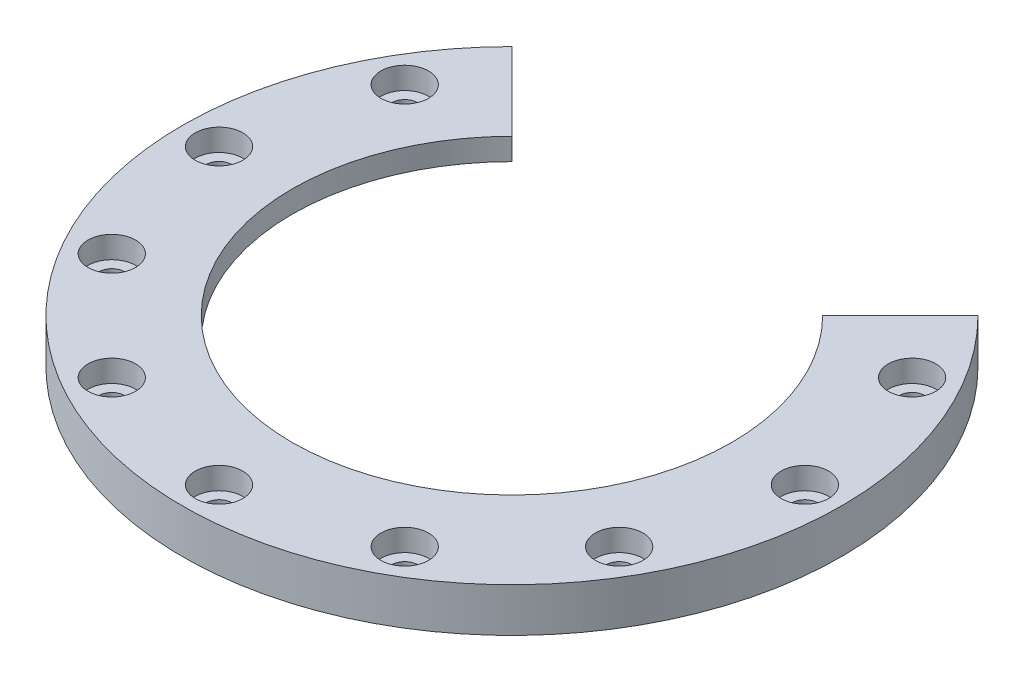
ISO-10303-21;
HEADER;
FILE_DESCRIPTION(('STEP AP214'),'2;1');
FILE_NAME('part.step','',(''),(''),'','','');
FILE_SCHEMA(('AUTOMOTIVE_DESIGN { 1 0 10303 214 1 1 1 1 }'));
ENDSEC;
DATA;
#1=APPLICATION_CONTEXT('core data for automotive mechanical design processes');
#2=APPLICATION_PROTOCOL_DEFINITION('international standard','automotive_design',2000,#1);
#3=PRODUCT_CONTEXT('',#1,'mechanical');
#4=PRODUCT('Part','Part','',(#3));
#5=PRODUCT_RELATED_PRODUCT_CATEGORY('part','',(#4));
#6=PRODUCT_DEFINITION_FORMATION('','',#4);
#7=PRODUCT_DEFINITION_CONTEXT('part definition',#1,'design');
#8=PRODUCT_DEFINITION('design','',#6,#7);
#9=PRODUCT_DEFINITION_SHAPE('','',#8);
#10=(LENGTH_UNIT() NAMED_UNIT(*) SI_UNIT(.MILLI.,.METRE.));
#11=(NAMED_UNIT(*) PLANE_ANGLE_UNIT() SI_UNIT($,.RADIAN.));
#12=(NAMED_UNIT(*) SI_UNIT($,.STERADIAN.) SOLID_ANGLE_UNIT());
#13=UNCERTAINTY_MEASURE_WITH_UNIT(LENGTH_MEASURE(1.E-05),#10,'distance_accuracy_value','');
#14=(GEOMETRIC_REPRESENTATION_CONTEXT(3) GLOBAL_UNCERTAINTY_ASSIGNED_CONTEXT((#13)) GLOBAL_UNIT_ASSIGNED_CONTEXT((#10,
#11,#12)) REPRESENTATION_CONTEXT('',''));
#15=CARTESIAN_POINT('',(0.,0.,0.));
#16=DIRECTION('',(0.,0.,1.));
#17=DIRECTION('',(1.,0.,0.));
#18=AXIS2_PLACEMENT_3D('',#15,#16,#17);
#19=CARTESIAN_POINT('',(0.,6.,0.));
#20=DIRECTION('',(0.,-1.,0.));
#21=DIRECTION('',(0.,0.,-1.));
#22=AXIS2_PLACEMENT_3D('',#19,#20,#21);
#23=CYLINDRICAL_SURFACE('',#22,30.);
#24=CARTESIAN_POINT('',(0.,3.,0.));
#25=DIRECTION('',(0.,-1.,0.));
#26=DIRECTION('',(0.,0.,-1.));
#27=AXIS2_PLACEMENT_3D('',#24,#25,#26);
#28=CIRCLE('',#27,30.);
#29=CARTESIAN_POINT('',(21.2132034355963,3.,-21.2132034355965));
#30=VERTEX_POINT('',#29);
#31=CARTESIAN_POINT('',(-21.2132034355963,3.,-21.2132034355965));
#32=VERTEX_POINT('',#31);
#33=EDGE_CURVE('E107',#30,#32,#28,.T.);
#34=ORIENTED_EDGE('',*,*,#33,.T.);
#35=DIRECTION('',(0.,-1.,0.));
#36=VECTOR('',#35,1.);
#37=CARTESIAN_POINT('',(-21.2132034355963,6.,-21.2132034355965));
#38=LINE('',#37,#36);
#39=CARTESIAN_POINT('',(-21.2132034355963,6.,-21.2132034355965));
#40=VERTEX_POINT('',#39);
#41=EDGE_CURVE('E56',#32,#40,#38,.F.);
#42=ORIENTED_EDGE('',*,*,#41,.T.);
#43=CARTESIAN_POINT('',(0.,6.,0.));
#44=DIRECTION('',(0.,1.,0.));
#45=DIRECTION('',(0.,0.,1.));
#46=AXIS2_PLACEMENT_3D('',#43,#44,#45);
#47=CIRCLE('',#46,30.);
#48=CARTESIAN_POINT('',(21.2132034355963,6.,-21.2132034355965));
#49=VERTEX_POINT('',#48);
#50=EDGE_CURVE('E141',#40,#49,#47,.T.);
#51=ORIENTED_EDGE('',*,*,#50,.T.);
#52=DIRECTION('',(0.,-1.,0.));
#53=VECTOR('',#52,1.);
#54=CARTESIAN_POINT('',(21.2132034355963,6.,-21.2132034355965));
#55=LINE('',#54,#53);
#56=EDGE_CURVE('E101',#49,#30,#55,.T.);
#57=ORIENTED_EDGE('',*,*,#56,.T.);
#58=EDGE_LOOP('',(#34,#42,#51,#57));
#59=FACE_BOUND('',#58,.T.);
#60=ADVANCED_FACE('F33',(#59),#23,.F.);
#61=CARTESIAN_POINT('',(0.,6.,0.));
#62=DIRECTION('',(0.,1.,0.));
#63=DIRECTION('',(0.,0.,1.));
#64=AXIS2_PLACEMENT_3D('',#61,#62,#63);
#65=PLANE('',#64);
#66=CARTESIAN_POINT('',(40.0000000000057,6.,-5.67944329888421E-12));
#67=DIRECTION('',(0.,1.,0.));
#68=DIRECTION('',(0.,0.,1.));
#69=AXIS2_PLACEMENT_3D('',#66,#67,#68);
#70=CIRCLE('',#69,3.25);
#71=CARTESIAN_POINT('',(40.0000000000057,6.,3.24999999999432));
#72=VERTEX_POINT('',#71);
#73=EDGE_CURVE('E175',#72,#72,#70,.T.);
#74=ORIENTED_EDGE('',*,*,#73,.F.);
#75=EDGE_LOOP('',(#74));
#76=FACE_BOUND('',#75,.T.);
#77=CARTESIAN_POINT('',(34.6410161513769,6.,-20.000000000007));
#78=DIRECTION('',(0.,1.,0.));
#79=DIRECTION('',(0.,0.,1.));
#80=AXIS2_PLACEMENT_3D('',#77,#78,#79);
#81=CIRCLE('',#80,3.25);
#82=CARTESIAN_POINT('',(34.6410161513769,6.,-16.7500000000071));
#83=VERTEX_POINT('',#82);
#84=EDGE_CURVE('E196',#83,#83,#81,.T.);
#85=ORIENTED_EDGE('',*,*,#84,.F.);
#86=EDGE_LOOP('',(#85));
#87=FACE_BOUND('',#86,.T.);
#88=CARTESIAN_POINT('',(-34.6410161513881,6.,-19.9999999999876));
#89=DIRECTION('',(0.,1.,0.));
#90=DIRECTION('',(0.,0.,1.));
#91=AXIS2_PLACEMENT_3D('',#88,#89,#90);
#92=CIRCLE('',#91,3.25);
#93=CARTESIAN_POINT('',(-34.6410161513881,6.,-16.7499999999876));
#94=VERTEX_POINT('',#93);
#95=EDGE_CURVE('E235',#94,#94,#92,.T.);
#96=ORIENTED_EDGE('',*,*,#95,.F.);
#97=EDGE_LOOP('',(#96));
#98=FACE_BOUND('',#97,.T.);
#99=CARTESIAN_POINT('',(-40.0000000000057,6.,1.66977542903655E-11));
#100=DIRECTION('',(0.,1.,0.));
#101=DIRECTION('',(0.,0.,1.));
#102=AXIS2_PLACEMENT_3D('',#99,#100,#101);
#103=CIRCLE('',#102,3.25);
#104=CARTESIAN_POINT('',(-40.0000000000057,6.,3.2500000000167));
#105=VERTEX_POINT('',#104);
#106=EDGE_CURVE('E229',#105,#105,#103,.T.);
#107=ORIENTED_EDGE('',*,*,#106,.F.);
#108=EDGE_LOOP('',(#107));
#109=FACE_BOUND('',#108,.T.);
#110=CARTESIAN_POINT('',(-34.6410161513769,6.,20.000000000018));
#111=DIRECTION('',(0.,1.,0.));
#112=DIRECTION('',(0.,0.,1.));
#113=AXIS2_PLACEMENT_3D('',#110,#111,#112);
#114=CIRCLE('',#113,3.25);
#115=CARTESIAN_POINT('',(-34.6410161513769,6.,23.250000000018));
#116=VERTEX_POINT('',#115);
#117=EDGE_CURVE('E223',#116,#116,#114,.T.);
#118=ORIENTED_EDGE('',*,*,#117,.F.);
#119=EDGE_LOOP('',(#118));
#120=FACE_BOUND('',#119,.T.);
#121=CARTESIAN_POINT('',(-19.9999999999931,6.,34.6410161513936));
#122=DIRECTION('',(0.,1.,0.));
#123=DIRECTION('',(0.,0.,1.));
#124=AXIS2_PLACEMENT_3D('',#121,#122,#123);
#125=CIRCLE('',#124,3.25);
#126=CARTESIAN_POINT('',(-19.9999999999931,6.,37.8910161513936));
#127=VERTEX_POINT('',#126);
#128=EDGE_CURVE('E217',#127,#127,#125,.T.);
#129=ORIENTED_EDGE('',*,*,#128,.F.);
#130=EDGE_LOOP('',(#129));
#131=FACE_BOUND('',#130,.T.);
#132=CARTESIAN_POINT('',(1.11885987946249E-11,6.,40.0000000000112));
#133=DIRECTION('',(0.,1.,0.));
#134=DIRECTION('',(0.,0.,1.));
#135=AXIS2_PLACEMENT_3D('',#132,#133,#134);
#136=CIRCLE('',#135,3.25);
#137=CARTESIAN_POINT('',(1.11885987946249E-11,6.,43.2500000000112));
#138=VERTEX_POINT('',#137);
#139=EDGE_CURVE('E211',#138,#138,#136,.T.);
#140=ORIENTED_EDGE('',*,*,#139,.F.);
#141=EDGE_LOOP('',(#140));
#142=FACE_BOUND('',#141,.T.);
#143=CARTESIAN_POINT('',(20.0000000000125,6.,34.6410161513824));
#144=DIRECTION('',(0.,1.,0.));
#145=DIRECTION('',(0.,0.,1.));
#146=AXIS2_PLACEMENT_3D('',#143,#144,#145);
#147=CIRCLE('',#146,3.25);
#148=CARTESIAN_POINT('',(20.0000000000125,6.,37.8910161513824));
#149=VERTEX_POINT('',#148);
#150=EDGE_CURVE('E205',#149,#149,#147,.T.);
#151=ORIENTED_EDGE('',*,*,#150,.F.);
#152=EDGE_LOOP('',(#151));
#153=FACE_BOUND('',#152,.T.);
#154=CARTESIAN_POINT('',(34.6410161513881,6.,19.9999999999987));
#155=DIRECTION('',(0.,1.,0.));
#156=DIRECTION('',(0.,0.,1.));
#157=AXIS2_PLACEMENT_3D('',#154,#155,#156);
#158=CIRCLE('',#157,3.25);
#159=CARTESIAN_POINT('',(34.6410161513881,6.,23.2499999999987));
#160=VERTEX_POINT('',#159);
#161=EDGE_CURVE('E199',#160,#160,#158,.T.);
#162=ORIENTED_EDGE('',*,*,#161,.F.);
#163=EDGE_LOOP('',(#162));
#164=FACE_BOUND('',#163,.T.);
#165=ORIENTED_EDGE('',*,*,#50,.F.);
#166=DIRECTION('',(-0.707106781186544,0.,-0.707106781186551));
#167=VECTOR('',#166,1.);
#168=CARTESIAN_POINT('',(0.,6.,0.));
#169=LINE('',#168,#167);
#170=CARTESIAN_POINT('',(-31.8198051533945,6.,-31.8198051533948));
#171=VERTEX_POINT('',#170);
#172=EDGE_CURVE('E191',#40,#171,#169,.T.);
#173=ORIENTED_EDGE('',*,*,#172,.T.);
#174=CARTESIAN_POINT('',(0.,6.,0.));
#175=DIRECTION('',(0.,1.,0.));
#176=DIRECTION('',(0.,0.,1.));
#177=AXIS2_PLACEMENT_3D('',#174,#175,#176);
#178=CIRCLE('',#177,45.);
#179=CARTESIAN_POINT('',(31.8198051533945,6.,-31.8198051533948));
#180=VERTEX_POINT('',#179);
#181=EDGE_CURVE('E145',#171,#180,#178,.T.);
#182=ORIENTED_EDGE('',*,*,#181,.T.);
#183=DIRECTION('',(-0.707106781186544,0.,0.707106781186551));
#184=VECTOR('',#183,1.);
#185=CARTESIAN_POINT('',(0.,6.,0.));
#186=LINE('',#185,#184);
#187=EDGE_CURVE('E183',#180,#49,#186,.T.);
#188=ORIENTED_EDGE('',*,*,#187,.T.);
#189=EDGE_LOOP('',(#165,#173,#182,#188));
#190=FACE_BOUND('',#189,.T.);
#191=ADVANCED_FACE('F249',(#76,#87,#98,#109,#120,#131,#142,#153,#164,#190),#65,.T.);
#192=CARTESIAN_POINT('',(0.,0.,0.));
#193=DIRECTION('',(0.,1.,0.));
#194=DIRECTION('',(0.,0.,1.));
#195=AXIS2_PLACEMENT_3D('',#192,#193,#194);
#196=PLANE('',#195);
#197=CARTESIAN_POINT('',(-34.6410161513747,0.,-19.9999999999951));
#198=DIRECTION('',(0.,1.,0.));
#199=DIRECTION('',(0.,0.,1.));
#200=AXIS2_PLACEMENT_3D('',#197,#198,#199);
#201=CIRCLE('',#200,1.75000000000464);
#202=CARTESIAN_POINT('',(-34.6410161513747,0.,-18.2499999999904));
#203=VERTEX_POINT('',#202);
#204=EDGE_CURVE('E114',#203,#203,#201,.T.);
#205=ORIENTED_EDGE('',*,*,#204,.T.);
#206=EDGE_LOOP('',(#205));
#207=FACE_BOUND('',#206,.T.);
#208=CARTESIAN_POINT('',(-39.9999999999943,0.,5.6843418860808E-12));
#209=DIRECTION('',(0.,1.,0.));
#210=DIRECTION('',(0.,0.,1.));
#211=AXIS2_PLACEMENT_3D('',#208,#209,#210);
#212=CIRCLE('',#211,1.75000000000749);
#213=CARTESIAN_POINT('',(-39.9999999999943,0.,1.75000000001318));
#214=VERTEX_POINT('',#213);
#215=EDGE_CURVE('E117',#214,#214,#212,.T.);
#216=ORIENTED_EDGE('',*,*,#215,.T.);
#217=EDGE_LOOP('',(#216));
#218=FACE_BOUND('',#217,.T.);
#219=CARTESIAN_POINT('',(-34.641016151369,0.,20.0000000000049));
#220=DIRECTION('',(0.,1.,0.));
#221=DIRECTION('',(0.,0.,1.));
#222=AXIS2_PLACEMENT_3D('',#219,#220,#221);
#223=CIRCLE('',#222,1.75000000000994);
#224=CARTESIAN_POINT('',(-34.641016151369,0.,21.7500000000149));
#225=VERTEX_POINT('',#224);
#226=EDGE_CURVE('E120',#225,#225,#223,.T.);
#227=ORIENTED_EDGE('',*,*,#226,.T.);
#228=EDGE_LOOP('',(#227));
#229=FACE_BOUND('',#228,.T.);
#230=CARTESIAN_POINT('',(-19.9999999999894,0.,34.6410161513804));
#231=DIRECTION('',(0.,1.,0.));
#232=DIRECTION('',(0.,0.,1.));
#233=AXIS2_PLACEMENT_3D('',#230,#231,#232);
#234=CIRCLE('',#233,1.75000000001128);
#235=CARTESIAN_POINT('',(-19.9999999999894,0.,36.3910161513917));
#236=VERTEX_POINT('',#235);
#237=EDGE_CURVE('E123',#236,#236,#234,.T.);
#238=ORIENTED_EDGE('',*,*,#237,.T.);
#239=EDGE_LOOP('',(#238));
#240=FACE_BOUND('',#239,.T.);
#241=CARTESIAN_POINT('',(1.13588865977684E-11,0.,40.));
#242=DIRECTION('',(0.,1.,0.));
#243=DIRECTION('',(0.,0.,1.));
#244=AXIS2_PLACEMENT_3D('',#241,#242,#243);
#245=CIRCLE('',#244,1.75000000001113);
#246=CARTESIAN_POINT('',(1.13588865977684E-11,0.,41.7500000000111));
#247=VERTEX_POINT('',#246);
#248=EDGE_CURVE('E126',#247,#247,#245,.T.);
#249=ORIENTED_EDGE('',*,*,#248,.T.);
#250=EDGE_LOOP('',(#249));
#251=FACE_BOUND('',#250,.T.);
#252=CARTESIAN_POINT('',(20.0000000000106,0.,34.6410161513747));
#253=DIRECTION('',(0.,1.,0.));
#254=DIRECTION('',(0.,0.,1.));
#255=AXIS2_PLACEMENT_3D('',#252,#253,#254);
#256=CIRCLE('',#255,1.75000000000955);
#257=CARTESIAN_POINT('',(20.0000000000106,0.,36.3910161513842));
#258=VERTEX_POINT('',#257);
#259=EDGE_CURVE('E129',#258,#258,#256,.T.);
#260=ORIENTED_EDGE('',*,*,#259,.T.);
#261=EDGE_LOOP('',(#260));
#262=FACE_BOUND('',#261,.T.);
#263=CARTESIAN_POINT('',(34.6410161513861,0.,19.9999999999951));
#264=DIRECTION('',(0.,1.,0.));
#265=DIRECTION('',(0.,0.,1.));
#266=AXIS2_PLACEMENT_3D('',#263,#264,#265);
#267=CIRCLE('',#266,1.75000000000689);
#268=CARTESIAN_POINT('',(34.6410161513861,0.,21.750000000002));
#269=VERTEX_POINT('',#268);
#270=EDGE_CURVE('E132',#269,#269,#267,.T.);
#271=ORIENTED_EDGE('',*,*,#270,.T.);
#272=EDGE_LOOP('',(#271));
#273=FACE_BOUND('',#272,.T.);
#274=CARTESIAN_POINT('',(40.0000000000057,0.,-5.67944329888421E-12));
#275=DIRECTION('',(0.,1.,0.));
#276=DIRECTION('',(0.,0.,1.));
#277=AXIS2_PLACEMENT_3D('',#274,#275,#276);
#278=CIRCLE('',#277,1.75000000000391);
#279=CARTESIAN_POINT('',(40.0000000000057,0.,1.74999999999823));
#280=VERTEX_POINT('',#279);
#281=EDGE_CURVE('E135',#280,#280,#278,.T.);
#282=ORIENTED_EDGE('',*,*,#281,.T.);
#283=EDGE_LOOP('',(#282));
#284=FACE_BOUND('',#283,.T.);
#285=CARTESIAN_POINT('',(34.6410161513804,0.,-20.0000000000049));
#286=DIRECTION('',(0.,1.,0.));
#287=DIRECTION('',(0.,0.,1.));
#288=AXIS2_PLACEMENT_3D('',#285,#286,#287);
#289=CIRCLE('',#288,1.75000000000137);
#290=CARTESIAN_POINT('',(34.6410161513804,0.,-18.2500000000036));
#291=VERTEX_POINT('',#290);
#292=EDGE_CURVE('E138',#291,#291,#289,.T.);
#293=ORIENTED_EDGE('',*,*,#292,.T.);
#294=EDGE_LOOP('',(#293));
#295=FACE_BOUND('',#294,.T.);
#296=DIRECTION('',(0.707106781186544,0.,0.707106781186551));
#297=VECTOR('',#296,1.);
#298=CARTESIAN_POINT('',(-38.8908729652599,0.,-38.8908729652603));
#299=LINE('',#298,#297);
#300=CARTESIAN_POINT('',(-31.8198051533945,0.,-31.8198051533948));
#301=VERTEX_POINT('',#300);
#302=CARTESIAN_POINT('',(-25.1022907321223,0.,-25.1022907321226));
#303=VERTEX_POINT('',#302);
#304=EDGE_CURVE('E91',#301,#303,#299,.T.);
#305=ORIENTED_EDGE('',*,*,#304,.T.);
#306=CARTESIAN_POINT('',(0.,0.,0.));
#307=DIRECTION('',(0.,-1.,0.));
#308=DIRECTION('',(0.,0.,-1.));
#309=AXIS2_PLACEMENT_3D('',#306,#307,#308);
#310=CIRCLE('',#309,35.5);
#311=CARTESIAN_POINT('',(25.1022907321223,0.,-25.1022907321226));
#312=VERTEX_POINT('',#311);
#313=EDGE_CURVE('E98',#312,#303,#310,.T.);
#314=ORIENTED_EDGE('',*,*,#313,.F.);
#315=DIRECTION('',(0.707106781186544,0.,-0.707106781186551));
#316=VECTOR('',#315,1.);
#317=CARTESIAN_POINT('',(38.8908729652599,0.,-38.8908729652603));
#318=LINE('',#317,#316);
#319=CARTESIAN_POINT('',(31.8198051533945,0.,-31.8198051533948));
#320=VERTEX_POINT('',#319);
#321=EDGE_CURVE('E83',#312,#320,#318,.T.);
#322=ORIENTED_EDGE('',*,*,#321,.T.);
#323=CARTESIAN_POINT('',(0.,0.,0.));
#324=DIRECTION('',(0.,1.,0.));
#325=DIRECTION('',(0.,0.,1.));
#326=AXIS2_PLACEMENT_3D('',#323,#324,#325);
#327=CIRCLE('',#326,45.);
#328=EDGE_CURVE('E144',#301,#320,#327,.T.);
#329=ORIENTED_EDGE('',*,*,#328,.F.);
#330=EDGE_LOOP('',(#305,#314,#322,#329));
#331=FACE_BOUND('',#330,.T.);
#332=ADVANCED_FACE('F104',(#207,#218,#229,#240,#251,#262,#273,#284,#295,#331),#196,.F.);
#333=CARTESIAN_POINT('',(0.,6.,0.));
#334=DIRECTION('',(0.,-1.,0.));
#335=DIRECTION('',(0.,0.,-1.));
#336=AXIS2_PLACEMENT_3D('',#333,#334,#335);
#337=CYLINDRICAL_SURFACE('',#336,45.);
#338=DIRECTION('',(0.,-1.,0.));
#339=VECTOR('',#338,1.);
#340=CARTESIAN_POINT('',(-31.8198051533945,6.,-31.8198051533948));
#341=LINE('',#340,#339);
#342=EDGE_CURVE('E194',#301,#171,#341,.F.);
#343=ORIENTED_EDGE('',*,*,#342,.F.);
#344=ORIENTED_EDGE('',*,*,#328,.T.);
#345=DIRECTION('',(0.,-1.,0.));
#346=VECTOR('',#345,1.);
#347=CARTESIAN_POINT('',(31.8198051533945,6.,-31.8198051533948));
#348=LINE('',#347,#346);
#349=EDGE_CURVE('E86',#180,#320,#348,.T.);
#350=ORIENTED_EDGE('',*,*,#349,.F.);
#351=ORIENTED_EDGE('',*,*,#181,.F.);
#352=EDGE_LOOP('',(#343,#344,#350,#351));
#353=FACE_BOUND('',#352,.T.);
#354=ADVANCED_FACE('F35',(#353),#337,.T.);
#355=CARTESIAN_POINT('',(0.,3.,0.));
#356=DIRECTION('',(0.,-1.,0.));
#357=DIRECTION('',(0.,0.,-1.));
#358=AXIS2_PLACEMENT_3D('',#355,#356,#357);
#359=CYLINDRICAL_SURFACE('',#358,35.5);
#360=DIRECTION('',(0.,-1.,0.));
#361=VECTOR('',#360,1.);
#362=CARTESIAN_POINT('',(-25.1022907321223,3.,-25.1022907321226));
#363=LINE('',#362,#361);
#364=CARTESIAN_POINT('',(-25.1022907321223,3.,-25.1022907321226));
#365=VERTEX_POINT('',#364);
#366=EDGE_CURVE('E188',#365,#303,#363,.T.);
#367=ORIENTED_EDGE('',*,*,#366,.F.);
#368=CARTESIAN_POINT('',(0.,3.,0.));
#369=DIRECTION('',(0.,-1.,0.));
#370=DIRECTION('',(0.,0.,-1.));
#371=AXIS2_PLACEMENT_3D('',#368,#369,#370);
#372=CIRCLE('',#371,35.5);
#373=CARTESIAN_POINT('',(25.1022907321223,3.,-25.1022907321226));
#374=VERTEX_POINT('',#373);
#375=EDGE_CURVE('E100',#374,#365,#372,.T.);
#376=ORIENTED_EDGE('',*,*,#375,.F.);
#377=DIRECTION('',(0.,-1.,0.));
#378=VECTOR('',#377,1.);
#379=CARTESIAN_POINT('',(25.1022907321223,3.,-25.1022907321226));
#380=LINE('',#379,#378);
#381=EDGE_CURVE('E48',#312,#374,#380,.F.);
#382=ORIENTED_EDGE('',*,*,#381,.F.);
#383=ORIENTED_EDGE('',*,*,#313,.T.);
#384=EDGE_LOOP('',(#367,#376,#382,#383));
#385=FACE_BOUND('',#384,.T.);
#386=ADVANCED_FACE('F97',(#385),#359,.F.);
#387=CARTESIAN_POINT('',(0.,3.,0.));
#388=DIRECTION('',(0.,-1.,0.));
#389=DIRECTION('',(0.,0.,-1.));
#390=AXIS2_PLACEMENT_3D('',#387,#388,#389);
#391=PLANE('',#390);
#392=ORIENTED_EDGE('',*,*,#375,.T.);
#393=DIRECTION('',(0.707106781186544,0.,0.707106781186551));
#394=VECTOR('',#393,1.);
#395=CARTESIAN_POINT('',(0.,3.,0.));
#396=LINE('',#395,#394);
#397=EDGE_CURVE('E11',#365,#32,#396,.T.);
#398=ORIENTED_EDGE('',*,*,#397,.T.);
#399=ORIENTED_EDGE('',*,*,#33,.F.);
#400=DIRECTION('',(0.707106781186544,0.,-0.707106781186551));
#401=VECTOR('',#400,1.);
#402=CARTESIAN_POINT('',(0.,3.,0.));
#403=LINE('',#402,#401);
#404=EDGE_CURVE('E41',#30,#374,#403,.T.);
#405=ORIENTED_EDGE('',*,*,#404,.T.);
#406=EDGE_LOOP('',(#392,#398,#399,#405));
#407=FACE_BOUND('',#406,.T.);
#408=ADVANCED_FACE('F178',(#407),#391,.T.);
#409=CARTESIAN_POINT('',(34.6410161513804,6.,-20.0000000000049));
#410=DIRECTION('',(0.,-1.,0.));
#411=DIRECTION('',(0.,0.,-1.));
#412=AXIS2_PLACEMENT_3D('',#409,#410,#411);
#413=CYLINDRICAL_SURFACE('',#412,1.75000000000137);
#414=ORIENTED_EDGE('',*,*,#292,.F.);
#415=EDGE_LOOP('',(#414));
#416=FACE_BOUND('',#415,.T.);
#417=CARTESIAN_POINT('',(34.6410161513804,3.,-20.0000000000049));
#418=DIRECTION('',(0.,1.,0.));
#419=DIRECTION('',(0.,0.,1.));
#420=AXIS2_PLACEMENT_3D('',#417,#418,#419);
#421=CIRCLE('',#420,1.75000000000137);
#422=CARTESIAN_POINT('',(34.6410161513804,3.,-18.2500000000036));
#423=VERTEX_POINT('',#422);
#424=EDGE_CURVE('E173',#423,#423,#421,.T.);
#425=ORIENTED_EDGE('',*,*,#424,.T.);
#426=EDGE_LOOP('',(#425));
#427=FACE_BOUND('',#426,.T.);
#428=ADVANCED_FACE('F288',(#416,#427),#413,.F.);
#429=CARTESIAN_POINT('',(34.6410161513861,6.,19.9999999999951));
#430=DIRECTION('',(0.,-1.,0.));
#431=DIRECTION('',(0.,0.,-1.));
#432=AXIS2_PLACEMENT_3D('',#429,#430,#431);
#433=CYLINDRICAL_SURFACE('',#432,1.75000000000689);
#434=ORIENTED_EDGE('',*,*,#270,.F.);
#435=EDGE_LOOP('',(#434));
#436=FACE_BOUND('',#435,.T.);
#437=CARTESIAN_POINT('',(34.6410161513861,3.,19.9999999999951));
#438=DIRECTION('',(0.,1.,0.));
#439=DIRECTION('',(0.,0.,1.));
#440=AXIS2_PLACEMENT_3D('',#437,#438,#439);
#441=CIRCLE('',#440,1.75000000000689);
#442=CARTESIAN_POINT('',(34.6410161513861,3.,21.750000000002));
#443=VERTEX_POINT('',#442);
#444=EDGE_CURVE('E170',#443,#443,#441,.T.);
#445=ORIENTED_EDGE('',*,*,#444,.T.);
#446=EDGE_LOOP('',(#445));
#447=FACE_BOUND('',#446,.T.);
#448=ADVANCED_FACE('F315',(#436,#447),#433,.F.);
#449=CARTESIAN_POINT('',(20.0000000000106,6.,34.6410161513747));
#450=DIRECTION('',(0.,-1.,0.));
#451=DIRECTION('',(0.,0.,-1.));
#452=AXIS2_PLACEMENT_3D('',#449,#450,#451);
#453=CYLINDRICAL_SURFACE('',#452,1.75000000000955);
#454=ORIENTED_EDGE('',*,*,#259,.F.);
#455=EDGE_LOOP('',(#454));
#456=FACE_BOUND('',#455,.T.);
#457=CARTESIAN_POINT('',(20.0000000000106,3.,34.6410161513747));
#458=DIRECTION('',(0.,1.,0.));
#459=DIRECTION('',(0.,0.,1.));
#460=AXIS2_PLACEMENT_3D('',#457,#458,#459);
#461=CIRCLE('',#460,1.75000000000955);
#462=CARTESIAN_POINT('',(20.0000000000106,3.,36.3910161513842));
#463=VERTEX_POINT('',#462);
#464=EDGE_CURVE('E167',#463,#463,#461,.T.);
#465=ORIENTED_EDGE('',*,*,#464,.T.);
#466=EDGE_LOOP('',(#465));
#467=FACE_BOUND('',#466,.T.);
#468=ADVANCED_FACE('F367',(#456,#467),#453,.F.);
#469=CARTESIAN_POINT('',(1.13588865977684E-11,6.,40.));
#470=DIRECTION('',(0.,-1.,0.));
#471=DIRECTION('',(0.,0.,-1.));
#472=AXIS2_PLACEMENT_3D('',#469,#470,#471);
#473=CYLINDRICAL_SURFACE('',#472,1.75000000001113);
#474=ORIENTED_EDGE('',*,*,#248,.F.);
#475=EDGE_LOOP('',(#474));
#476=FACE_BOUND('',#475,.T.);
#477=CARTESIAN_POINT('',(1.13588865977684E-11,3.,40.));
#478=DIRECTION('',(0.,1.,0.));
#479=DIRECTION('',(0.,0.,1.));
#480=AXIS2_PLACEMENT_3D('',#477,#478,#479);
#481=CIRCLE('',#480,1.75000000001113);
#482=CARTESIAN_POINT('',(1.13588865977684E-11,3.,41.7500000000111));
#483=VERTEX_POINT('',#482);
#484=EDGE_CURVE('E164',#483,#483,#481,.T.);
#485=ORIENTED_EDGE('',*,*,#484,.T.);
#486=EDGE_LOOP('',(#485));
#487=FACE_BOUND('',#486,.T.);
#488=ADVANCED_FACE('F363',(#476,#487),#473,.F.);
#489=CARTESIAN_POINT('',(-19.9999999999894,6.,34.6410161513804));
#490=DIRECTION('',(0.,-1.,0.));
#491=DIRECTION('',(0.,0.,-1.));
#492=AXIS2_PLACEMENT_3D('',#489,#490,#491);
#493=CYLINDRICAL_SURFACE('',#492,1.75000000001128);
#494=ORIENTED_EDGE('',*,*,#237,.F.);
#495=EDGE_LOOP('',(#494));
#496=FACE_BOUND('',#495,.T.);
#497=CARTESIAN_POINT('',(-19.9999999999894,3.,34.6410161513804));
#498=DIRECTION('',(0.,1.,0.));
#499=DIRECTION('',(0.,0.,1.));
#500=AXIS2_PLACEMENT_3D('',#497,#498,#499);
#501=CIRCLE('',#500,1.75000000001128);
#502=CARTESIAN_POINT('',(-19.9999999999894,3.,36.3910161513917));
#503=VERTEX_POINT('',#502);
#504=EDGE_CURVE('E161',#503,#503,#501,.T.);
#505=ORIENTED_EDGE('',*,*,#504,.T.);
#506=EDGE_LOOP('',(#505));
#507=FACE_BOUND('',#506,.T.);
#508=ADVANCED_FACE('F359',(#496,#507),#493,.F.);
#509=CARTESIAN_POINT('',(-34.641016151369,6.,20.0000000000049));
#510=DIRECTION('',(0.,-1.,0.));
#511=DIRECTION('',(0.,0.,-1.));
#512=AXIS2_PLACEMENT_3D('',#509,#510,#511);
#513=CYLINDRICAL_SURFACE('',#512,1.75000000000994);
#514=ORIENTED_EDGE('',*,*,#226,.F.);
#515=EDGE_LOOP('',(#514));
#516=FACE_BOUND('',#515,.T.);
#517=CARTESIAN_POINT('',(-34.641016151369,3.,20.0000000000049));
#518=DIRECTION('',(0.,1.,0.));
#519=DIRECTION('',(0.,0.,1.));
#520=AXIS2_PLACEMENT_3D('',#517,#518,#519);
#521=CIRCLE('',#520,1.75000000000994);
#522=CARTESIAN_POINT('',(-34.641016151369,3.,21.7500000000149));
#523=VERTEX_POINT('',#522);
#524=EDGE_CURVE('E158',#523,#523,#521,.T.);
#525=ORIENTED_EDGE('',*,*,#524,.T.);
#526=EDGE_LOOP('',(#525));
#527=FACE_BOUND('',#526,.T.);
#528=ADVANCED_FACE('F355',(#516,#527),#513,.F.);
#529=CARTESIAN_POINT('',(-39.9999999999943,6.,5.6843418860808E-12));
#530=DIRECTION('',(0.,-1.,0.));
#531=DIRECTION('',(0.,0.,-1.));
#532=AXIS2_PLACEMENT_3D('',#529,#530,#531);
#533=CYLINDRICAL_SURFACE('',#532,1.75000000000749);
#534=ORIENTED_EDGE('',*,*,#215,.F.);
#535=EDGE_LOOP('',(#534));
#536=FACE_BOUND('',#535,.T.);
#537=CARTESIAN_POINT('',(-39.9999999999943,3.,5.6843418860808E-12));
#538=DIRECTION('',(0.,1.,0.));
#539=DIRECTION('',(0.,0.,1.));
#540=AXIS2_PLACEMENT_3D('',#537,#538,#539);
#541=CIRCLE('',#540,1.75000000000749);
#542=CARTESIAN_POINT('',(-39.9999999999943,3.,1.75000000001318));
#543=VERTEX_POINT('',#542);
#544=EDGE_CURVE('E154',#543,#543,#541,.T.);
#545=ORIENTED_EDGE('',*,*,#544,.T.);
#546=EDGE_LOOP('',(#545));
#547=FACE_BOUND('',#546,.T.);
#548=ADVANCED_FACE('F351',(#536,#547),#533,.F.);
#549=CARTESIAN_POINT('',(-34.6410161513747,6.,-19.9999999999951));
#550=DIRECTION('',(0.,-1.,0.));
#551=DIRECTION('',(0.,0.,-1.));
#552=AXIS2_PLACEMENT_3D('',#549,#550,#551);
#553=CYLINDRICAL_SURFACE('',#552,1.75000000000464);
#554=ORIENTED_EDGE('',*,*,#204,.F.);
#555=EDGE_LOOP('',(#554));
#556=FACE_BOUND('',#555,.T.);
#557=CARTESIAN_POINT('',(-34.6410161513747,3.,-19.9999999999951));
#558=DIRECTION('',(0.,1.,0.));
#559=DIRECTION('',(0.,0.,1.));
#560=AXIS2_PLACEMENT_3D('',#557,#558,#559);
#561=CIRCLE('',#560,1.75000000000464);
#562=CARTESIAN_POINT('',(-34.6410161513747,3.,-18.2499999999904));
#563=VERTEX_POINT('',#562);
#564=EDGE_CURVE('E151',#563,#563,#561,.T.);
#565=ORIENTED_EDGE('',*,*,#564,.T.);
#566=EDGE_LOOP('',(#565));
#567=FACE_BOUND('',#566,.T.);
#568=ADVANCED_FACE('F348',(#556,#567),#553,.F.);
#569=CARTESIAN_POINT('',(40.0000000000057,6.,-5.67944329888421E-12));
#570=DIRECTION('',(0.,-1.,0.));
#571=DIRECTION('',(0.,0.,-1.));
#572=AXIS2_PLACEMENT_3D('',#569,#570,#571);
#573=CYLINDRICAL_SURFACE('',#572,1.75000000000391);
#574=ORIENTED_EDGE('',*,*,#281,.F.);
#575=EDGE_LOOP('',(#574));
#576=FACE_BOUND('',#575,.T.);
#577=CARTESIAN_POINT('',(40.0000000000057,3.,-5.67944329888421E-12));
#578=DIRECTION('',(0.,1.,0.));
#579=DIRECTION('',(0.,0.,1.));
#580=AXIS2_PLACEMENT_3D('',#577,#578,#579);
#581=CIRCLE('',#580,1.75000000000391);
#582=CARTESIAN_POINT('',(40.0000000000057,3.,1.74999999999823));
#583=VERTEX_POINT('',#582);
#584=EDGE_CURVE('E105',#583,#583,#581,.T.);
#585=ORIENTED_EDGE('',*,*,#584,.T.);
#586=EDGE_LOOP('',(#585));
#587=FACE_BOUND('',#586,.T.);
#588=ADVANCED_FACE('F342',(#576,#587),#573,.F.);
#589=CARTESIAN_POINT('',(40.0000000000057,3.,-5.67944329888421E-12));
#590=DIRECTION('',(0.,1.,0.));
#591=DIRECTION('',(0.,0.,1.));
#592=AXIS2_PLACEMENT_3D('',#589,#590,#591);
#593=CYLINDRICAL_SURFACE('',#592,3.25);
#594=CARTESIAN_POINT('',(40.0000000000057,3.,-5.67944329888421E-12));
#595=DIRECTION('',(0.,1.,0.));
#596=DIRECTION('',(0.,0.,1.));
#597=AXIS2_PLACEMENT_3D('',#594,#595,#596);
#598=CIRCLE('',#597,3.25);
#599=CARTESIAN_POINT('',(40.0000000000057,3.,3.24999999999432));
#600=VERTEX_POINT('',#599);
#601=EDGE_CURVE('E110',#600,#600,#598,.T.);
#602=ORIENTED_EDGE('',*,*,#601,.F.);
#603=EDGE_LOOP('',(#602));
#604=FACE_BOUND('',#603,.T.);
#605=ORIENTED_EDGE('',*,*,#73,.T.);
#606=EDGE_LOOP('',(#605));
#607=FACE_BOUND('',#606,.T.);
#608=ADVANCED_FACE('F247',(#604,#607),#593,.F.);
#609=CARTESIAN_POINT('',(40.0000000000057,3.,-5.67944329888421E-12));
#610=DIRECTION('',(0.,1.,0.));
#611=DIRECTION('',(0.,0.,1.));
#612=AXIS2_PLACEMENT_3D('',#609,#610,#611);
#613=PLANE('',#612);
#614=ORIENTED_EDGE('',*,*,#584,.F.);
#615=EDGE_LOOP('',(#614));
#616=FACE_BOUND('',#615,.T.);
#617=ORIENTED_EDGE('',*,*,#601,.T.);
#618=EDGE_LOOP('',(#617));
#619=FACE_BOUND('',#618,.T.);
#620=ADVANCED_FACE('F335',(#616,#619),#613,.T.);
#621=CARTESIAN_POINT('',(-34.6410161513881,3.,-19.9999999999876));
#622=DIRECTION('',(0.,1.,0.));
#623=DIRECTION('',(0.,0.,1.));
#624=AXIS2_PLACEMENT_3D('',#621,#622,#623);
#625=CYLINDRICAL_SURFACE('',#624,3.25);
#626=CARTESIAN_POINT('',(-34.6410161513881,3.,-19.9999999999876));
#627=DIRECTION('',(0.,1.,0.));
#628=DIRECTION('',(0.,0.,1.));
#629=AXIS2_PLACEMENT_3D('',#626,#627,#628);
#630=CIRCLE('',#629,3.25);
#631=CARTESIAN_POINT('',(-34.6410161513881,3.,-16.7499999999876));
#632=VERTEX_POINT('',#631);
#633=EDGE_CURVE('E232',#632,#632,#630,.T.);
#634=ORIENTED_EDGE('',*,*,#633,.F.);
#635=EDGE_LOOP('',(#634));
#636=FACE_BOUND('',#635,.T.);
#637=ORIENTED_EDGE('',*,*,#95,.T.);
#638=EDGE_LOOP('',(#637));
#639=FACE_BOUND('',#638,.T.);
#640=ADVANCED_FACE('F338',(#636,#639),#625,.F.);
#641=CARTESIAN_POINT('',(-34.6410161513881,3.,-19.9999999999876));
#642=DIRECTION('',(0.,1.,0.));
#643=DIRECTION('',(0.,0.,1.));
#644=AXIS2_PLACEMENT_3D('',#641,#642,#643);
#645=PLANE('',#644);
#646=ORIENTED_EDGE('',*,*,#564,.F.);
#647=EDGE_LOOP('',(#646));
#648=FACE_BOUND('',#647,.T.);
#649=ORIENTED_EDGE('',*,*,#633,.T.);
#650=EDGE_LOOP('',(#649));
#651=FACE_BOUND('',#650,.T.);
#652=ADVANCED_FACE('F398',(#648,#651),#645,.T.);
#653=CARTESIAN_POINT('',(-40.0000000000057,3.,1.66977542903655E-11));
#654=DIRECTION('',(0.,1.,0.));
#655=DIRECTION('',(0.,0.,1.));
#656=AXIS2_PLACEMENT_3D('',#653,#654,#655);
#657=CYLINDRICAL_SURFACE('',#656,3.25);
#658=CARTESIAN_POINT('',(-40.0000000000057,3.,1.66977542903655E-11));
#659=DIRECTION('',(0.,1.,0.));
#660=DIRECTION('',(0.,0.,1.));
#661=AXIS2_PLACEMENT_3D('',#658,#659,#660);
#662=CIRCLE('',#661,3.25);
#663=CARTESIAN_POINT('',(-40.0000000000057,3.,3.2500000000167));
#664=VERTEX_POINT('',#663);
#665=EDGE_CURVE('E226',#664,#664,#662,.T.);
#666=ORIENTED_EDGE('',*,*,#665,.F.);
#667=EDGE_LOOP('',(#666));
#668=FACE_BOUND('',#667,.T.);
#669=ORIENTED_EDGE('',*,*,#106,.T.);
#670=EDGE_LOOP('',(#669));
#671=FACE_BOUND('',#670,.T.);
#672=ADVANCED_FACE('F405',(#668,#671),#657,.F.);
#673=CARTESIAN_POINT('',(-40.0000000000057,3.,1.66977542903655E-11));
#674=DIRECTION('',(0.,1.,0.));
#675=DIRECTION('',(0.,0.,1.));
#676=AXIS2_PLACEMENT_3D('',#673,#674,#675);
#677=PLANE('',#676);
#678=ORIENTED_EDGE('',*,*,#544,.F.);
#679=EDGE_LOOP('',(#678));
#680=FACE_BOUND('',#679,.T.);
#681=ORIENTED_EDGE('',*,*,#665,.T.);
#682=EDGE_LOOP('',(#681));
#683=FACE_BOUND('',#682,.T.);
#684=ADVANCED_FACE('F413',(#680,#683),#677,.T.);
#685=CARTESIAN_POINT('',(-34.6410161513769,3.,20.000000000018));
#686=DIRECTION('',(0.,1.,0.));
#687=DIRECTION('',(0.,0.,1.));
#688=AXIS2_PLACEMENT_3D('',#685,#686,#687);
#689=CYLINDRICAL_SURFACE('',#688,3.25);
#690=CARTESIAN_POINT('',(-34.6410161513769,3.,20.000000000018));
#691=DIRECTION('',(0.,1.,0.));
#692=DIRECTION('',(0.,0.,1.));
#693=AXIS2_PLACEMENT_3D('',#690,#691,#692);
#694=CIRCLE('',#693,3.25);
#695=CARTESIAN_POINT('',(-34.6410161513769,3.,23.250000000018));
#696=VERTEX_POINT('',#695);
#697=EDGE_CURVE('E220',#696,#696,#694,.T.);
#698=ORIENTED_EDGE('',*,*,#697,.F.);
#699=EDGE_LOOP('',(#698));
#700=FACE_BOUND('',#699,.T.);
#701=ORIENTED_EDGE('',*,*,#117,.T.);
#702=EDGE_LOOP('',(#701));
#703=FACE_BOUND('',#702,.T.);
#704=ADVANCED_FACE('F421',(#700,#703),#689,.F.);
#705=CARTESIAN_POINT('',(-34.6410161513769,3.,20.000000000018));
#706=DIRECTION('',(0.,1.,0.));
#707=DIRECTION('',(0.,0.,1.));
#708=AXIS2_PLACEMENT_3D('',#705,#706,#707);
#709=PLANE('',#708);
#710=ORIENTED_EDGE('',*,*,#524,.F.);
#711=EDGE_LOOP('',(#710));
#712=FACE_BOUND('',#711,.T.);
#713=ORIENTED_EDGE('',*,*,#697,.T.);
#714=EDGE_LOOP('',(#713));
#715=FACE_BOUND('',#714,.T.);
#716=ADVANCED_FACE('F429',(#712,#715),#709,.T.);
#717=CARTESIAN_POINT('',(-19.9999999999931,3.,34.6410161513936));
#718=DIRECTION('',(0.,1.,0.));
#719=DIRECTION('',(0.,0.,1.));
#720=AXIS2_PLACEMENT_3D('',#717,#718,#719);
#721=CYLINDRICAL_SURFACE('',#720,3.25);
#722=CARTESIAN_POINT('',(-19.9999999999931,3.,34.6410161513936));
#723=DIRECTION('',(0.,1.,0.));
#724=DIRECTION('',(0.,0.,1.));
#725=AXIS2_PLACEMENT_3D('',#722,#723,#724);
#726=CIRCLE('',#725,3.25);
#727=CARTESIAN_POINT('',(-19.9999999999931,3.,37.8910161513936));
#728=VERTEX_POINT('',#727);
#729=EDGE_CURVE('E214',#728,#728,#726,.T.);
#730=ORIENTED_EDGE('',*,*,#729,.F.);
#731=EDGE_LOOP('',(#730));
#732=FACE_BOUND('',#731,.T.);
#733=ORIENTED_EDGE('',*,*,#128,.T.);
#734=EDGE_LOOP('',(#733));
#735=FACE_BOUND('',#734,.T.);
#736=ADVANCED_FACE('F437',(#732,#735),#721,.F.);
#737=CARTESIAN_POINT('',(-19.9999999999931,3.,34.6410161513936));
#738=DIRECTION('',(0.,1.,0.));
#739=DIRECTION('',(0.,0.,1.));
#740=AXIS2_PLACEMENT_3D('',#737,#738,#739);
#741=PLANE('',#740);
#742=ORIENTED_EDGE('',*,*,#504,.F.);
#743=EDGE_LOOP('',(#742));
#744=FACE_BOUND('',#743,.T.);
#745=ORIENTED_EDGE('',*,*,#729,.T.);
#746=EDGE_LOOP('',(#745));
#747=FACE_BOUND('',#746,.T.);
#748=ADVANCED_FACE('F445',(#744,#747),#741,.T.);
#749=CARTESIAN_POINT('',(1.11885987946249E-11,3.,40.0000000000112));
#750=DIRECTION('',(0.,1.,0.));
#751=DIRECTION('',(0.,0.,1.));
#752=AXIS2_PLACEMENT_3D('',#749,#750,#751);
#753=CYLINDRICAL_SURFACE('',#752,3.25);
#754=CARTESIAN_POINT('',(1.11885987946249E-11,3.,40.0000000000112));
#755=DIRECTION('',(0.,1.,0.));
#756=DIRECTION('',(0.,0.,1.));
#757=AXIS2_PLACEMENT_3D('',#754,#755,#756);
#758=CIRCLE('',#757,3.25);
#759=CARTESIAN_POINT('',(1.11885987946249E-11,3.,43.2500000000112));
#760=VERTEX_POINT('',#759);
#761=EDGE_CURVE('E208',#760,#760,#758,.T.);
#762=ORIENTED_EDGE('',*,*,#761,.F.);
#763=EDGE_LOOP('',(#762));
#764=FACE_BOUND('',#763,.T.);
#765=ORIENTED_EDGE('',*,*,#139,.T.);
#766=EDGE_LOOP('',(#765));
#767=FACE_BOUND('',#766,.T.);
#768=ADVANCED_FACE('F453',(#764,#767),#753,.F.);
#769=CARTESIAN_POINT('',(1.11885987946249E-11,3.,40.0000000000112));
#770=DIRECTION('',(0.,1.,0.));
#771=DIRECTION('',(0.,0.,1.));
#772=AXIS2_PLACEMENT_3D('',#769,#770,#771);
#773=PLANE('',#772);
#774=ORIENTED_EDGE('',*,*,#484,.F.);
#775=EDGE_LOOP('',(#774));
#776=FACE_BOUND('',#775,.T.);
#777=ORIENTED_EDGE('',*,*,#761,.T.);
#778=EDGE_LOOP('',(#777));
#779=FACE_BOUND('',#778,.T.);
#780=ADVANCED_FACE('F461',(#776,#779),#773,.T.);
#781=CARTESIAN_POINT('',(20.0000000000125,3.,34.6410161513824));
#782=DIRECTION('',(0.,1.,0.));
#783=DIRECTION('',(0.,0.,1.));
#784=AXIS2_PLACEMENT_3D('',#781,#782,#783);
#785=CYLINDRICAL_SURFACE('',#784,3.25);
#786=CARTESIAN_POINT('',(20.0000000000125,3.,34.6410161513824));
#787=DIRECTION('',(0.,1.,0.));
#788=DIRECTION('',(0.,0.,1.));
#789=AXIS2_PLACEMENT_3D('',#786,#787,#788);
#790=CIRCLE('',#789,3.25);
#791=CARTESIAN_POINT('',(20.0000000000125,3.,37.8910161513824));
#792=VERTEX_POINT('',#791);
#793=EDGE_CURVE('E202',#792,#792,#790,.T.);
#794=ORIENTED_EDGE('',*,*,#793,.F.);
#795=EDGE_LOOP('',(#794));
#796=FACE_BOUND('',#795,.T.);
#797=ORIENTED_EDGE('',*,*,#150,.T.);
#798=EDGE_LOOP('',(#797));
#799=FACE_BOUND('',#798,.T.);
#800=ADVANCED_FACE('F469',(#796,#799),#785,.F.);
#801=CARTESIAN_POINT('',(20.0000000000125,3.,34.6410161513824));
#802=DIRECTION('',(0.,1.,0.));
#803=DIRECTION('',(0.,0.,1.));
#804=AXIS2_PLACEMENT_3D('',#801,#802,#803);
#805=PLANE('',#804);
#806=ORIENTED_EDGE('',*,*,#464,.F.);
#807=EDGE_LOOP('',(#806));
#808=FACE_BOUND('',#807,.T.);
#809=ORIENTED_EDGE('',*,*,#793,.T.);
#810=EDGE_LOOP('',(#809));
#811=FACE_BOUND('',#810,.T.);
#812=ADVANCED_FACE('F477',(#808,#811),#805,.T.);
#813=CARTESIAN_POINT('',(34.6410161513881,3.,19.9999999999987));
#814=DIRECTION('',(0.,1.,0.));
#815=DIRECTION('',(0.,0.,1.));
#816=AXIS2_PLACEMENT_3D('',#813,#814,#815);
#817=CYLINDRICAL_SURFACE('',#816,3.25);
#818=CARTESIAN_POINT('',(34.6410161513881,3.,19.9999999999987));
#819=DIRECTION('',(0.,1.,0.));
#820=DIRECTION('',(0.,0.,1.));
#821=AXIS2_PLACEMENT_3D('',#818,#819,#820);
#822=CIRCLE('',#821,3.25);
#823=CARTESIAN_POINT('',(34.6410161513881,3.,23.2499999999987));
#824=VERTEX_POINT('',#823);
#825=EDGE_CURVE('E155',#824,#824,#822,.T.);
#826=ORIENTED_EDGE('',*,*,#825,.F.);
#827=EDGE_LOOP('',(#826));
#828=FACE_BOUND('',#827,.T.);
#829=ORIENTED_EDGE('',*,*,#161,.T.);
#830=EDGE_LOOP('',(#829));
#831=FACE_BOUND('',#830,.T.);
#832=ADVANCED_FACE('F331',(#828,#831),#817,.F.);
#833=CARTESIAN_POINT('',(34.6410161513881,3.,19.9999999999987));
#834=DIRECTION('',(0.,1.,0.));
#835=DIRECTION('',(0.,0.,1.));
#836=AXIS2_PLACEMENT_3D('',#833,#834,#835);
#837=PLANE('',#836);
#838=ORIENTED_EDGE('',*,*,#444,.F.);
#839=EDGE_LOOP('',(#838));
#840=FACE_BOUND('',#839,.T.);
#841=ORIENTED_EDGE('',*,*,#825,.T.);
#842=EDGE_LOOP('',(#841));
#843=FACE_BOUND('',#842,.T.);
#844=ADVANCED_FACE('F326',(#840,#843),#837,.T.);
#845=CARTESIAN_POINT('',(34.6410161513769,3.,-20.000000000007));
#846=DIRECTION('',(0.,1.,0.));
#847=DIRECTION('',(0.,0.,1.));
#848=AXIS2_PLACEMENT_3D('',#845,#846,#847);
#849=CYLINDRICAL_SURFACE('',#848,3.25);
#850=CARTESIAN_POINT('',(34.6410161513769,3.,-20.000000000007));
#851=DIRECTION('',(0.,1.,0.));
#852=DIRECTION('',(0.,0.,1.));
#853=AXIS2_PLACEMENT_3D('',#850,#851,#852);
#854=CIRCLE('',#853,3.25);
#855=CARTESIAN_POINT('',(34.6410161513769,3.,-16.7500000000071));
#856=VERTEX_POINT('',#855);
#857=EDGE_CURVE('E238',#856,#856,#854,.T.);
#858=ORIENTED_EDGE('',*,*,#857,.F.);
#859=EDGE_LOOP('',(#858));
#860=FACE_BOUND('',#859,.T.);
#861=ORIENTED_EDGE('',*,*,#84,.T.);
#862=EDGE_LOOP('',(#861));
#863=FACE_BOUND('',#862,.T.);
#864=ADVANCED_FACE('F320',(#860,#863),#849,.F.);
#865=CARTESIAN_POINT('',(34.6410161513769,3.,-20.000000000007));
#866=DIRECTION('',(0.,1.,0.));
#867=DIRECTION('',(0.,0.,1.));
#868=AXIS2_PLACEMENT_3D('',#865,#866,#867);
#869=PLANE('',#868);
#870=ORIENTED_EDGE('',*,*,#424,.F.);
#871=EDGE_LOOP('',(#870));
#872=FACE_BOUND('',#871,.T.);
#873=ORIENTED_EDGE('',*,*,#857,.T.);
#874=EDGE_LOOP('',(#873));
#875=FACE_BOUND('',#874,.T.);
#876=ADVANCED_FACE('F279',(#872,#875),#869,.T.);
#877=CARTESIAN_POINT('',(38.8908729652599,10.,-38.8908729652603));
#878=DIRECTION('',(-0.707106781186551,0.,-0.707106781186544));
#879=DIRECTION('',(-0.707106781186544,0.,0.707106781186551));
#880=AXIS2_PLACEMENT_3D('',#877,#878,#879);
#881=PLANE('',#880);
#882=ORIENTED_EDGE('',*,*,#349,.T.);
#883=ORIENTED_EDGE('',*,*,#321,.F.);
#884=ORIENTED_EDGE('',*,*,#381,.T.);
#885=ORIENTED_EDGE('',*,*,#404,.F.);
#886=ORIENTED_EDGE('',*,*,#56,.F.);
#887=ORIENTED_EDGE('',*,*,#187,.F.);
#888=EDGE_LOOP('',(#882,#883,#884,#885,#886,#887));
#889=FACE_BOUND('',#888,.T.);
#890=ADVANCED_FACE('F84',(#889),#881,.T.);
#891=CARTESIAN_POINT('',(-38.8908729652599,10.,-38.8908729652603));
#892=DIRECTION('',(0.707106781186551,0.,-0.707106781186544));
#893=DIRECTION('',(-0.707106781186544,0.,-0.707106781186551));
#894=AXIS2_PLACEMENT_3D('',#891,#892,#893);
#895=PLANE('',#894);
#896=ORIENTED_EDGE('',*,*,#342,.T.);
#897=ORIENTED_EDGE('',*,*,#172,.F.);
#898=ORIENTED_EDGE('',*,*,#41,.F.);
#899=ORIENTED_EDGE('',*,*,#397,.F.);
#900=ORIENTED_EDGE('',*,*,#366,.T.);
#901=ORIENTED_EDGE('',*,*,#304,.F.);
#902=EDGE_LOOP('',(#896,#897,#898,#899,#900,#901));
#903=FACE_BOUND('',#902,.T.);
#904=ADVANCED_FACE('F272',(#903),#895,.T.);
#905=CLOSED_SHELL('',(#60,#191,#332,#354,#386,#408,#428,#448,#468,#488,#508,#528,#548,#568,#588,
#608,#620,#640,#652,#672,#684,#704,#716,#736,#748,#768,#780,#800,#812,#832,#844,#864,#876,#890,#904));
#906=MANIFOLD_SOLID_BREP('B2',#905);
#907=ADVANCED_BREP_SHAPE_REPRESENTATION('',(#18,#906),#14);
#908=SHAPE_DEFINITION_REPRESENTATION(#9,#907);
ENDSEC;
END-ISO-10303-21;
